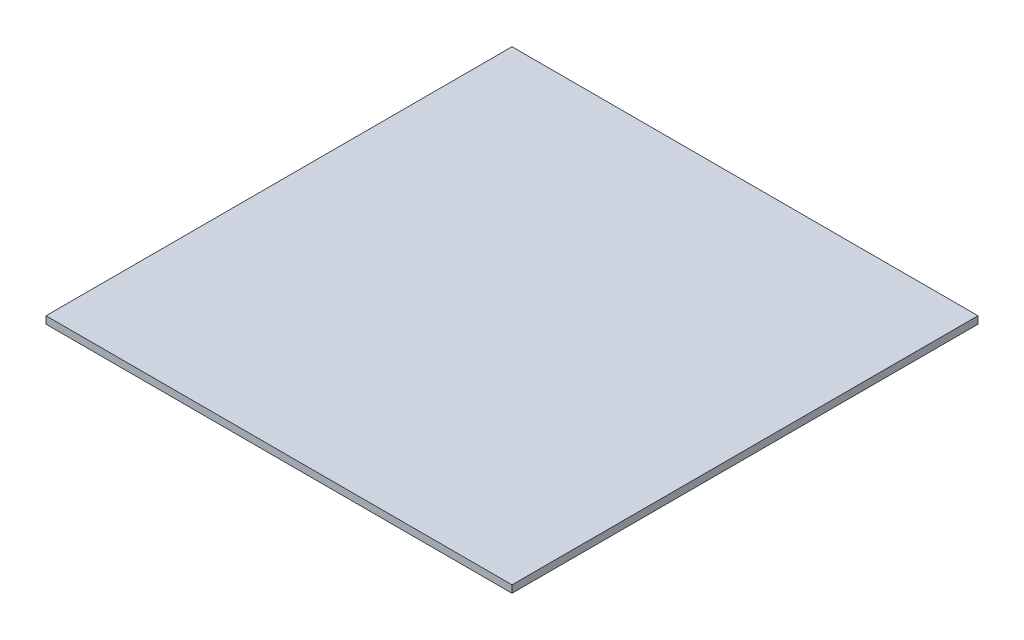
ISO-10303-21;
HEADER;
FILE_DESCRIPTION(('STEP AP214'),'2;1');
FILE_NAME('part.step','',(''),(''),'','','');
FILE_SCHEMA(('AUTOMOTIVE_DESIGN { 1 0 10303 214 1 1 1 1 }'));
ENDSEC;
DATA;
#1=APPLICATION_CONTEXT('core data for automotive mechanical design processes');
#2=APPLICATION_PROTOCOL_DEFINITION('international standard','automotive_design',2000,#1);
#3=PRODUCT_CONTEXT('',#1,'mechanical');
#4=PRODUCT('Part','Part','',(#3));
#5=PRODUCT_RELATED_PRODUCT_CATEGORY('part','',(#4));
#6=PRODUCT_DEFINITION_FORMATION('','',#4);
#7=PRODUCT_DEFINITION_CONTEXT('part definition',#1,'design');
#8=PRODUCT_DEFINITION('design','',#6,#7);
#9=PRODUCT_DEFINITION_SHAPE('','',#8);
#10=(LENGTH_UNIT() NAMED_UNIT(*) SI_UNIT(.MILLI.,.METRE.));
#11=(NAMED_UNIT(*) PLANE_ANGLE_UNIT() SI_UNIT($,.RADIAN.));
#12=(NAMED_UNIT(*) SI_UNIT($,.STERADIAN.) SOLID_ANGLE_UNIT());
#13=UNCERTAINTY_MEASURE_WITH_UNIT(LENGTH_MEASURE(1.E-05),#10,'distance_accuracy_value','');
#14=(GEOMETRIC_REPRESENTATION_CONTEXT(3) GLOBAL_UNCERTAINTY_ASSIGNED_CONTEXT((#13)) GLOBAL_UNIT_ASSIGNED_CONTEXT((#10,
#11,#12)) REPRESENTATION_CONTEXT('',''));
#15=CARTESIAN_POINT('',(0.,0.,0.));
#16=DIRECTION('',(0.,0.,1.));
#17=DIRECTION('',(1.,0.,0.));
#18=AXIS2_PLACEMENT_3D('',#15,#16,#17);
#19=CARTESIAN_POINT('',(31.75,1.,31.75));
#20=DIRECTION('',(-1.,0.,0.));
#21=DIRECTION('',(0.,0.,1.));
#22=AXIS2_PLACEMENT_3D('',#19,#20,#21);
#23=PLANE('',#22);
#24=DIRECTION('',(0.,0.,-1.));
#25=VECTOR('',#24,1.);
#26=CARTESIAN_POINT('',(31.75,0.,31.75));
#27=LINE('',#26,#25);
#28=CARTESIAN_POINT('',(31.75,0.,31.75));
#29=VERTEX_POINT('',#28);
#30=CARTESIAN_POINT('',(31.75,0.,-31.75));
#31=VERTEX_POINT('',#30);
#32=EDGE_CURVE('E100',#29,#31,#27,.T.);
#33=ORIENTED_EDGE('',*,*,#32,.T.);
#34=DIRECTION('',(0.,-1.,0.));
#35=VECTOR('',#34,1.);
#36=CARTESIAN_POINT('',(31.75,1.,-31.75));
#37=LINE('',#36,#35);
#38=CARTESIAN_POINT('',(31.75,1.,-31.75));
#39=VERTEX_POINT('',#38);
#40=EDGE_CURVE('E11',#39,#31,#37,.T.);
#41=ORIENTED_EDGE('',*,*,#40,.F.);
#42=DIRECTION('',(0.,0.,-1.));
#43=VECTOR('',#42,1.);
#44=CARTESIAN_POINT('',(31.75,1.,31.75));
#45=LINE('',#44,#43);
#46=CARTESIAN_POINT('',(31.75,1.,31.75));
#47=VERTEX_POINT('',#46);
#48=EDGE_CURVE('E88',#47,#39,#45,.T.);
#49=ORIENTED_EDGE('',*,*,#48,.F.);
#50=DIRECTION('',(0.,-1.,0.));
#51=VECTOR('',#50,1.);
#52=CARTESIAN_POINT('',(31.75,1.,31.75));
#53=LINE('',#52,#51);
#54=EDGE_CURVE('E96',#47,#29,#53,.T.);
#55=ORIENTED_EDGE('',*,*,#54,.T.);
#56=EDGE_LOOP('',(#33,#41,#49,#55));
#57=FACE_BOUND('',#56,.T.);
#58=ADVANCED_FACE('F37',(#57),#23,.F.);
#59=CARTESIAN_POINT('',(-31.75,1.,-31.75));
#60=DIRECTION('',(0.,0.,1.));
#61=DIRECTION('',(1.,0.,0.));
#62=AXIS2_PLACEMENT_3D('',#59,#60,#61);
#63=PLANE('',#62);
#64=DIRECTION('',(-1.,0.,0.));
#65=VECTOR('',#64,1.);
#66=CARTESIAN_POINT('',(-31.75,0.,-31.75));
#67=LINE('',#66,#65);
#68=CARTESIAN_POINT('',(-31.75,0.,-31.75));
#69=VERTEX_POINT('',#68);
#70=EDGE_CURVE('E92',#31,#69,#67,.T.);
#71=ORIENTED_EDGE('',*,*,#70,.T.);
#72=DIRECTION('',(0.,-1.,0.));
#73=VECTOR('',#72,1.);
#74=CARTESIAN_POINT('',(-31.75,1.,-31.75));
#75=LINE('',#74,#73);
#76=CARTESIAN_POINT('',(-31.75,1.,-31.75));
#77=VERTEX_POINT('',#76);
#78=EDGE_CURVE('E45',#77,#69,#75,.T.);
#79=ORIENTED_EDGE('',*,*,#78,.F.);
#80=DIRECTION('',(-1.,0.,0.));
#81=VECTOR('',#80,1.);
#82=CARTESIAN_POINT('',(-31.75,1.,-31.75));
#83=LINE('',#82,#81);
#84=EDGE_CURVE('E83',#39,#77,#83,.T.);
#85=ORIENTED_EDGE('',*,*,#84,.F.);
#86=ORIENTED_EDGE('',*,*,#40,.T.);
#87=EDGE_LOOP('',(#71,#79,#85,#86));
#88=FACE_BOUND('',#87,.T.);
#89=ADVANCED_FACE('F91',(#88),#63,.F.);
#90=CARTESIAN_POINT('',(-31.75,1.,31.75));
#91=DIRECTION('',(1.,0.,0.));
#92=DIRECTION('',(0.,0.,-1.));
#93=AXIS2_PLACEMENT_3D('',#90,#91,#92);
#94=PLANE('',#93);
#95=DIRECTION('',(0.,0.,1.));
#96=VECTOR('',#95,1.);
#97=CARTESIAN_POINT('',(-31.75,0.,31.75));
#98=LINE('',#97,#96);
#99=CARTESIAN_POINT('',(-31.75,0.,31.75));
#100=VERTEX_POINT('',#99);
#101=EDGE_CURVE('E70',#69,#100,#98,.T.);
#102=ORIENTED_EDGE('',*,*,#101,.T.);
#103=DIRECTION('',(0.,-1.,0.));
#104=VECTOR('',#103,1.);
#105=CARTESIAN_POINT('',(-31.75,1.,31.75));
#106=LINE('',#105,#104);
#107=CARTESIAN_POINT('',(-31.75,1.,31.75));
#108=VERTEX_POINT('',#107);
#109=EDGE_CURVE('E93',#108,#100,#106,.T.);
#110=ORIENTED_EDGE('',*,*,#109,.F.);
#111=DIRECTION('',(0.,0.,1.));
#112=VECTOR('',#111,1.);
#113=CARTESIAN_POINT('',(-31.75,1.,31.75));
#114=LINE('',#113,#112);
#115=EDGE_CURVE('E86',#77,#108,#114,.T.);
#116=ORIENTED_EDGE('',*,*,#115,.F.);
#117=ORIENTED_EDGE('',*,*,#78,.T.);
#118=EDGE_LOOP('',(#102,#110,#116,#117));
#119=FACE_BOUND('',#118,.T.);
#120=ADVANCED_FACE('F94',(#119),#94,.F.);
#121=CARTESIAN_POINT('',(-31.75,1.,31.75));
#122=DIRECTION('',(0.,0.,-1.));
#123=DIRECTION('',(-1.,0.,0.));
#124=AXIS2_PLACEMENT_3D('',#121,#122,#123);
#125=PLANE('',#124);
#126=DIRECTION('',(1.,0.,0.));
#127=VECTOR('',#126,1.);
#128=CARTESIAN_POINT('',(-31.75,0.,31.75));
#129=LINE('',#128,#127);
#130=EDGE_CURVE('E76',#100,#29,#129,.T.);
#131=ORIENTED_EDGE('',*,*,#130,.T.);
#132=ORIENTED_EDGE('',*,*,#54,.F.);
#133=DIRECTION('',(1.,0.,0.));
#134=VECTOR('',#133,1.);
#135=CARTESIAN_POINT('',(-31.75,1.,31.75));
#136=LINE('',#135,#134);
#137=EDGE_CURVE('E53',#108,#47,#136,.T.);
#138=ORIENTED_EDGE('',*,*,#137,.F.);
#139=ORIENTED_EDGE('',*,*,#109,.T.);
#140=EDGE_LOOP('',(#131,#132,#138,#139));
#141=FACE_BOUND('',#140,.T.);
#142=ADVANCED_FACE('F107',(#141),#125,.F.);
#143=CARTESIAN_POINT('',(0.,1.,0.));
#144=DIRECTION('',(0.,-1.,0.));
#145=DIRECTION('',(0.,0.,-1.));
#146=AXIS2_PLACEMENT_3D('',#143,#144,#145);
#147=PLANE('',#146);
#148=ORIENTED_EDGE('',*,*,#48,.T.);
#149=ORIENTED_EDGE('',*,*,#84,.T.);
#150=ORIENTED_EDGE('',*,*,#115,.T.);
#151=ORIENTED_EDGE('',*,*,#137,.T.);
#152=EDGE_LOOP('',(#148,#149,#150,#151));
#153=FACE_BOUND('',#152,.T.);
#154=ADVANCED_FACE('F84',(#153),#147,.F.);
#155=CARTESIAN_POINT('',(0.,0.,0.));
#156=DIRECTION('',(0.,-1.,0.));
#157=DIRECTION('',(0.,0.,-1.));
#158=AXIS2_PLACEMENT_3D('',#155,#156,#157);
#159=PLANE('',#158);
#160=ORIENTED_EDGE('',*,*,#32,.F.);
#161=ORIENTED_EDGE('',*,*,#130,.F.);
#162=ORIENTED_EDGE('',*,*,#101,.F.);
#163=ORIENTED_EDGE('',*,*,#70,.F.);
#164=EDGE_LOOP('',(#160,#161,#162,#163));
#165=FACE_BOUND('',#164,.T.);
#166=ADVANCED_FACE('F110',(#165),#159,.T.);
#167=CLOSED_SHELL('',(#58,#89,#120,#142,#154,#166));
#168=MANIFOLD_SOLID_BREP('B2',#167);
#169=ADVANCED_BREP_SHAPE_REPRESENTATION('',(#18,#168),#14);
#170=SHAPE_DEFINITION_REPRESENTATION(#9,#169);
ENDSEC;
END-ISO-10303-21;
